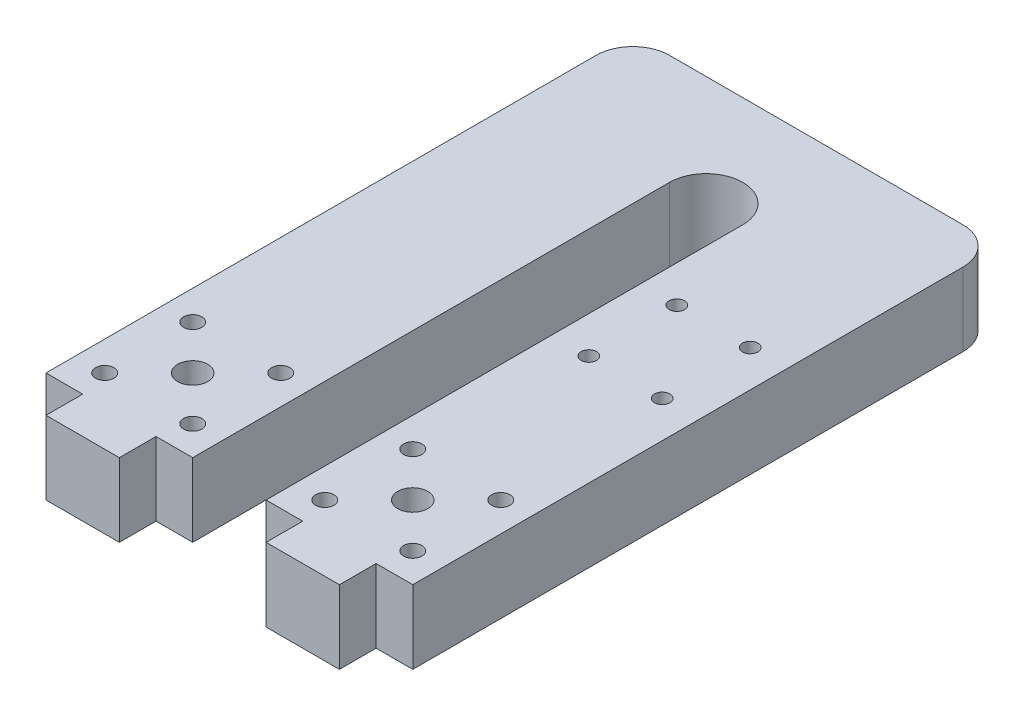
ISO-10303-21;
HEADER;
FILE_DESCRIPTION(('STEP AP214'),'2;1');
FILE_NAME('part.step','',(''),(''),'','','');
FILE_SCHEMA(('AUTOMOTIVE_DESIGN { 1 0 10303 214 1 1 1 1 }'));
ENDSEC;
DATA;
#1=APPLICATION_CONTEXT('core data for automotive mechanical design processes');
#2=APPLICATION_PROTOCOL_DEFINITION('international standard','automotive_design',2000,#1);
#3=PRODUCT_CONTEXT('',#1,'mechanical');
#4=PRODUCT('Part','Part','',(#3));
#5=PRODUCT_RELATED_PRODUCT_CATEGORY('part','',(#4));
#6=PRODUCT_DEFINITION_FORMATION('','',#4);
#7=PRODUCT_DEFINITION_CONTEXT('part definition',#1,'design');
#8=PRODUCT_DEFINITION('design','',#6,#7);
#9=PRODUCT_DEFINITION_SHAPE('','',#8);
#10=(LENGTH_UNIT() NAMED_UNIT(*) SI_UNIT(.MILLI.,.METRE.));
#11=(NAMED_UNIT(*) PLANE_ANGLE_UNIT() SI_UNIT($,.RADIAN.));
#12=(NAMED_UNIT(*) SI_UNIT($,.STERADIAN.) SOLID_ANGLE_UNIT());
#13=UNCERTAINTY_MEASURE_WITH_UNIT(LENGTH_MEASURE(1.E-05),#10,'distance_accuracy_value','');
#14=(GEOMETRIC_REPRESENTATION_CONTEXT(3) GLOBAL_UNCERTAINTY_ASSIGNED_CONTEXT((#13)) GLOBAL_UNIT_ASSIGNED_CONTEXT((#10,
#11,#12)) REPRESENTATION_CONTEXT('',''));
#15=CARTESIAN_POINT('',(0.,0.,0.));
#16=DIRECTION('',(0.,0.,1.));
#17=DIRECTION('',(1.,0.,0.));
#18=AXIS2_PLACEMENT_3D('',#15,#16,#17);
#19=CARTESIAN_POINT('',(-50.,20.,0.));
#20=DIRECTION('',(0.,0.,-1.));
#21=DIRECTION('',(-1.,0.,0.));
#22=AXIS2_PLACEMENT_3D('',#19,#20,#21);
#23=PLANE('',#22);
#24=DIRECTION('',(0.,-1.,0.));
#25=VECTOR('',#24,1.);
#26=CARTESIAN_POINT('',(-40.,0.,0.));
#27=LINE('',#26,#25);
#28=CARTESIAN_POINT('',(-40.,20.,0.));
#29=VERTEX_POINT('',#28);
#30=CARTESIAN_POINT('',(-40.,0.,0.));
#31=VERTEX_POINT('',#30);
#32=EDGE_CURVE('E59',#29,#31,#27,.T.);
#33=ORIENTED_EDGE('',*,*,#32,.F.);
#34=DIRECTION('',(1.,0.,0.));
#35=VECTOR('',#34,1.);
#36=CARTESIAN_POINT('',(-50.,20.,0.));
#37=LINE('',#36,#35);
#38=CARTESIAN_POINT('',(-50.,20.,0.));
#39=VERTEX_POINT('',#38);
#40=EDGE_CURVE('E294',#39,#29,#37,.T.);
#41=ORIENTED_EDGE('',*,*,#40,.F.);
#42=DIRECTION('',(0.,-1.,0.));
#43=VECTOR('',#42,1.);
#44=CARTESIAN_POINT('',(-50.,20.,0.));
#45=LINE('',#44,#43);
#46=CARTESIAN_POINT('',(-50.,0.,0.));
#47=VERTEX_POINT('',#46);
#48=EDGE_CURVE('E334',#39,#47,#45,.T.);
#49=ORIENTED_EDGE('',*,*,#48,.T.);
#50=DIRECTION('',(1.,0.,0.));
#51=VECTOR('',#50,1.);
#52=CARTESIAN_POINT('',(-50.,0.,0.));
#53=LINE('',#52,#51);
#54=EDGE_CURVE('E309',#47,#31,#53,.T.);
#55=ORIENTED_EDGE('',*,*,#54,.T.);
#56=EDGE_LOOP('',(#33,#41,#49,#55));
#57=FACE_BOUND('',#56,.T.);
#58=ADVANCED_FACE('F35',(#57),#23,.F.);
#59=DIRECTION('',(0.,1.,0.));
#60=VECTOR('',#59,1.);
#61=CARTESIAN_POINT('',(-20.,0.,0.));
#62=LINE('',#61,#60);
#63=CARTESIAN_POINT('',(-20.,0.,0.));
#64=VERTEX_POINT('',#63);
#65=CARTESIAN_POINT('',(-20.,20.,0.));
#66=VERTEX_POINT('',#65);
#67=EDGE_CURVE('E181',#64,#66,#62,.T.);
#68=ORIENTED_EDGE('',*,*,#67,.F.);
#69=CARTESIAN_POINT('',(-10.,0.,0.));
#70=VERTEX_POINT('',#69);
#71=EDGE_CURVE('E312',#64,#70,#53,.T.);
#72=ORIENTED_EDGE('',*,*,#71,.T.);
#73=DIRECTION('',(0.,1.,0.));
#74=VECTOR('',#73,1.);
#75=CARTESIAN_POINT('',(-10.,0.,0.));
#76=LINE('',#75,#74);
#77=CARTESIAN_POINT('',(-10.,20.,0.));
#78=VERTEX_POINT('',#77);
#79=EDGE_CURVE('E220',#70,#78,#76,.T.);
#80=ORIENTED_EDGE('',*,*,#79,.T.);
#81=EDGE_CURVE('E51',#66,#78,#37,.T.);
#82=ORIENTED_EDGE('',*,*,#81,.F.);
#83=EDGE_LOOP('',(#68,#72,#80,#82));
#84=FACE_BOUND('',#83,.T.);
#85=ADVANCED_FACE('F392',(#84),#23,.F.);
#86=DIRECTION('',(0.,-1.,0.));
#87=VECTOR('',#86,1.);
#88=CARTESIAN_POINT('',(20.,0.,0.));
#89=LINE('',#88,#87);
#90=CARTESIAN_POINT('',(20.,20.,0.));
#91=VERTEX_POINT('',#90);
#92=CARTESIAN_POINT('',(20.,0.,0.));
#93=VERTEX_POINT('',#92);
#94=EDGE_CURVE('E184',#91,#93,#89,.T.);
#95=ORIENTED_EDGE('',*,*,#94,.F.);
#96=CARTESIAN_POINT('',(10.,20.,0.));
#97=VERTEX_POINT('',#96);
#98=EDGE_CURVE('E297',#97,#91,#37,.T.);
#99=ORIENTED_EDGE('',*,*,#98,.F.);
#100=DIRECTION('',(0.,1.,0.));
#101=VECTOR('',#100,1.);
#102=CARTESIAN_POINT('',(10.,0.,0.));
#103=LINE('',#102,#101);
#104=CARTESIAN_POINT('',(10.,0.,0.));
#105=VERTEX_POINT('',#104);
#106=EDGE_CURVE('E225',#105,#97,#103,.T.);
#107=ORIENTED_EDGE('',*,*,#106,.F.);
#108=EDGE_CURVE('E313',#105,#93,#53,.T.);
#109=ORIENTED_EDGE('',*,*,#108,.T.);
#110=EDGE_LOOP('',(#95,#99,#107,#109));
#111=FACE_BOUND('',#110,.T.);
#112=ADVANCED_FACE('F423',(#111),#23,.F.);
#113=DIRECTION('',(0.,1.,0.));
#114=VECTOR('',#113,1.);
#115=CARTESIAN_POINT('',(40.,0.,0.));
#116=LINE('',#115,#114);
#117=CARTESIAN_POINT('',(40.,0.,0.));
#118=VERTEX_POINT('',#117);
#119=CARTESIAN_POINT('',(40.,20.,0.));
#120=VERTEX_POINT('',#119);
#121=EDGE_CURVE('E187',#118,#120,#116,.T.);
#122=ORIENTED_EDGE('',*,*,#121,.F.);
#123=CARTESIAN_POINT('',(50.,0.,0.));
#124=VERTEX_POINT('',#123);
#125=EDGE_CURVE('E308',#118,#124,#53,.T.);
#126=ORIENTED_EDGE('',*,*,#125,.T.);
#127=DIRECTION('',(0.,-1.,0.));
#128=VECTOR('',#127,1.);
#129=CARTESIAN_POINT('',(50.,20.,0.));
#130=LINE('',#129,#128);
#131=CARTESIAN_POINT('',(50.,20.,0.));
#132=VERTEX_POINT('',#131);
#133=EDGE_CURVE('E331',#132,#124,#130,.T.);
#134=ORIENTED_EDGE('',*,*,#133,.F.);
#135=EDGE_CURVE('E292',#120,#132,#37,.T.);
#136=ORIENTED_EDGE('',*,*,#135,.F.);
#137=EDGE_LOOP('',(#122,#126,#134,#136));
#138=FACE_BOUND('',#137,.T.);
#139=ADVANCED_FACE('F359',(#138),#23,.F.);
#140=CARTESIAN_POINT('',(0.,0.,-130.));
#141=DIRECTION('',(0.,1.,0.));
#142=DIRECTION('',(0.,0.,1.));
#143=AXIS2_PLACEMENT_3D('',#140,#141,#142);
#144=CYLINDRICAL_SURFACE('',#143,10.);
#145=DIRECTION('',(0.,-1.,0.));
#146=VECTOR('',#145,1.);
#147=CARTESIAN_POINT('',(-10.,0.,-130.));
#148=LINE('',#147,#146);
#149=CARTESIAN_POINT('',(-10.,0.,-130.));
#150=VERTEX_POINT('',#149);
#151=CARTESIAN_POINT('',(-10.,20.,-130.));
#152=VERTEX_POINT('',#151);
#153=EDGE_CURVE('E337',#150,#152,#148,.F.);
#154=ORIENTED_EDGE('',*,*,#153,.F.);
#155=CARTESIAN_POINT('',(0.,0.,-130.));
#156=DIRECTION('',(0.,-1.,0.));
#157=DIRECTION('',(0.,0.,-1.));
#158=AXIS2_PLACEMENT_3D('',#155,#156,#157);
#159=CIRCLE('',#158,10.);
#160=CARTESIAN_POINT('',(9.99999999999998,0.,-130.));
#161=VERTEX_POINT('',#160);
#162=EDGE_CURVE('E44',#150,#161,#159,.T.);
#163=ORIENTED_EDGE('',*,*,#162,.T.);
#164=DIRECTION('',(0.,-1.,0.));
#165=VECTOR('',#164,1.);
#166=CARTESIAN_POINT('',(9.99999999999998,0.,-130.));
#167=LINE('',#166,#165);
#168=CARTESIAN_POINT('',(9.99999999999998,20.,-130.));
#169=VERTEX_POINT('',#168);
#170=EDGE_CURVE('E340',#169,#161,#167,.T.);
#171=ORIENTED_EDGE('',*,*,#170,.F.);
#172=CARTESIAN_POINT('',(0.,20.,-130.));
#173=DIRECTION('',(0.,-1.,0.));
#174=DIRECTION('',(0.,0.,-1.));
#175=AXIS2_PLACEMENT_3D('',#172,#173,#174);
#176=CIRCLE('',#175,10.);
#177=EDGE_CURVE('E11',#169,#152,#176,.F.);
#178=ORIENTED_EDGE('',*,*,#177,.T.);
#179=EDGE_LOOP('',(#154,#163,#171,#178));
#180=FACE_BOUND('',#179,.T.);
#181=ADVANCED_FACE('F38',(#180),#144,.F.);
#182=CARTESIAN_POINT('',(-40.,20.,-150.));
#183=DIRECTION('',(0.,-1.,0.));
#184=DIRECTION('',(0.,0.,-1.));
#185=AXIS2_PLACEMENT_3D('',#182,#183,#184);
#186=PLANE('',#185);
#187=CARTESIAN_POINT('',(40.,20.,-102.));
#188=DIRECTION('',(0.,1.,0.));
#189=DIRECTION('',(0.,0.,1.));
#190=AXIS2_PLACEMENT_3D('',#187,#188,#189);
#191=CIRCLE('',#190,2.1);
#192=CARTESIAN_POINT('',(40.,20.,-99.9));
#193=VERTEX_POINT('',#192);
#194=EDGE_CURVE('E522',#193,#193,#191,.T.);
#195=ORIENTED_EDGE('',*,*,#194,.F.);
#196=EDGE_LOOP('',(#195));
#197=FACE_BOUND('',#196,.T.);
#198=CARTESIAN_POINT('',(20.,20.,-78.));
#199=DIRECTION('',(0.,1.,0.));
#200=DIRECTION('',(0.,0.,1.));
#201=AXIS2_PLACEMENT_3D('',#198,#199,#200);
#202=CIRCLE('',#201,2.1);
#203=CARTESIAN_POINT('',(20.,20.,-75.9));
#204=VERTEX_POINT('',#203);
#205=EDGE_CURVE('E518',#204,#204,#202,.T.);
#206=ORIENTED_EDGE('',*,*,#205,.F.);
#207=EDGE_LOOP('',(#206));
#208=FACE_BOUND('',#207,.T.);
#209=CARTESIAN_POINT('',(40.,20.,-78.));
#210=DIRECTION('',(0.,1.,0.));
#211=DIRECTION('',(0.,0.,1.));
#212=AXIS2_PLACEMENT_3D('',#209,#210,#211);
#213=CIRCLE('',#212,2.1);
#214=CARTESIAN_POINT('',(40.,20.,-75.9));
#215=VERTEX_POINT('',#214);
#216=EDGE_CURVE('E526',#215,#215,#213,.T.);
#217=ORIENTED_EDGE('',*,*,#216,.F.);
#218=EDGE_LOOP('',(#217));
#219=FACE_BOUND('',#218,.T.);
#220=CARTESIAN_POINT('',(20.,20.,-102.));
#221=DIRECTION('',(0.,1.,0.));
#222=DIRECTION('',(0.,0.,1.));
#223=AXIS2_PLACEMENT_3D('',#220,#221,#222);
#224=CIRCLE('',#223,2.1);
#225=CARTESIAN_POINT('',(20.,20.,-99.9));
#226=VERTEX_POINT('',#225);
#227=EDGE_CURVE('E513',#226,#226,#224,.T.);
#228=ORIENTED_EDGE('',*,*,#227,.F.);
#229=EDGE_LOOP('',(#228));
#230=FACE_BOUND('',#229,.T.);
#231=ORIENTED_EDGE('',*,*,#40,.T.);
#232=DIRECTION('',(0.,0.,-1.));
#233=VECTOR('',#232,1.);
#234=CARTESIAN_POINT('',(-40.,20.,10.));
#235=LINE('',#234,#233);
#236=CARTESIAN_POINT('',(-40.,20.,10.));
#237=VERTEX_POINT('',#236);
#238=EDGE_CURVE('E397',#237,#29,#235,.T.);
#239=ORIENTED_EDGE('',*,*,#238,.F.);
#240=DIRECTION('',(-1.,0.,0.));
#241=VECTOR('',#240,1.);
#242=CARTESIAN_POINT('',(-40.,20.,10.));
#243=LINE('',#242,#241);
#244=CARTESIAN_POINT('',(-20.,20.,10.));
#245=VERTEX_POINT('',#244);
#246=EDGE_CURVE('E177',#245,#237,#243,.T.);
#247=ORIENTED_EDGE('',*,*,#246,.F.);
#248=DIRECTION('',(0.,0.,-1.));
#249=VECTOR('',#248,1.);
#250=CARTESIAN_POINT('',(-20.,20.,10.));
#251=LINE('',#250,#249);
#252=EDGE_CURVE('E189',#245,#66,#251,.T.);
#253=ORIENTED_EDGE('',*,*,#252,.T.);
#254=ORIENTED_EDGE('',*,*,#81,.T.);
#255=DIRECTION('',(0.,0.,1.));
#256=VECTOR('',#255,1.);
#257=CARTESIAN_POINT('',(-10.,20.,0.));
#258=LINE('',#257,#256);
#259=EDGE_CURVE('E212',#152,#78,#258,.T.);
#260=ORIENTED_EDGE('',*,*,#259,.F.);
#261=ORIENTED_EDGE('',*,*,#177,.F.);
#262=DIRECTION('',(0.,0.,-1.));
#263=VECTOR('',#262,1.);
#264=CARTESIAN_POINT('',(10.,20.,0.));
#265=LINE('',#264,#263);
#266=EDGE_CURVE('E217',#97,#169,#265,.T.);
#267=ORIENTED_EDGE('',*,*,#266,.F.);
#268=ORIENTED_EDGE('',*,*,#98,.T.);
#269=DIRECTION('',(0.,0.,-1.));
#270=VECTOR('',#269,1.);
#271=CARTESIAN_POINT('',(20.,20.,10.));
#272=LINE('',#271,#270);
#273=CARTESIAN_POINT('',(20.,20.,10.));
#274=VERTEX_POINT('',#273);
#275=EDGE_CURVE('E201',#274,#91,#272,.T.);
#276=ORIENTED_EDGE('',*,*,#275,.F.);
#277=DIRECTION('',(-1.,0.,0.));
#278=VECTOR('',#277,1.);
#279=CARTESIAN_POINT('',(20.,20.,10.));
#280=LINE('',#279,#278);
#281=CARTESIAN_POINT('',(40.,20.,10.));
#282=VERTEX_POINT('',#281);
#283=EDGE_CURVE('E200',#282,#274,#280,.T.);
#284=ORIENTED_EDGE('',*,*,#283,.F.);
#285=DIRECTION('',(0.,0.,-1.));
#286=VECTOR('',#285,1.);
#287=CARTESIAN_POINT('',(40.,20.,10.));
#288=LINE('',#287,#286);
#289=EDGE_CURVE('E206',#282,#120,#288,.T.);
#290=ORIENTED_EDGE('',*,*,#289,.T.);
#291=ORIENTED_EDGE('',*,*,#135,.T.);
#292=DIRECTION('',(0.,0.,-1.));
#293=VECTOR('',#292,1.);
#294=CARTESIAN_POINT('',(50.,20.,0.));
#295=LINE('',#294,#293);
#296=CARTESIAN_POINT('',(50.,20.,-150.));
#297=VERTEX_POINT('',#296);
#298=EDGE_CURVE('E296',#132,#297,#295,.T.);
#299=ORIENTED_EDGE('',*,*,#298,.T.);
#300=CARTESIAN_POINT('',(40.,20.,-150.));
#301=DIRECTION('',(0.,1.,0.));
#302=DIRECTION('',(0.,0.,-1.));
#303=AXIS2_PLACEMENT_3D('',#300,#301,#302);
#304=CIRCLE('',#303,9.99999999999999);
#305=CARTESIAN_POINT('',(40.,20.,-160.));
#306=VERTEX_POINT('',#305);
#307=EDGE_CURVE('E299',#297,#306,#304,.T.);
#308=ORIENTED_EDGE('',*,*,#307,.T.);
#309=DIRECTION('',(-1.,0.,0.));
#310=VECTOR('',#309,1.);
#311=CARTESIAN_POINT('',(-40.,20.,-160.));
#312=LINE('',#311,#310);
#313=CARTESIAN_POINT('',(-40.,20.,-160.));
#314=VERTEX_POINT('',#313);
#315=EDGE_CURVE('E301',#306,#314,#312,.T.);
#316=ORIENTED_EDGE('',*,*,#315,.T.);
#317=CARTESIAN_POINT('',(-40.,20.,-150.));
#318=DIRECTION('',(0.,1.,0.));
#319=DIRECTION('',(0.,0.,-1.));
#320=AXIS2_PLACEMENT_3D('',#317,#318,#319);
#321=CIRCLE('',#320,9.99999999999999);
#322=CARTESIAN_POINT('',(-50.,20.,-150.));
#323=VERTEX_POINT('',#322);
#324=EDGE_CURVE('E303',#314,#323,#321,.T.);
#325=ORIENTED_EDGE('',*,*,#324,.T.);
#326=DIRECTION('',(0.,0.,1.));
#327=VECTOR('',#326,1.);
#328=CARTESIAN_POINT('',(-50.,20.,0.));
#329=LINE('',#328,#327);
#330=EDGE_CURVE('E289',#323,#39,#329,.T.);
#331=ORIENTED_EDGE('',*,*,#330,.T.);
#332=EDGE_LOOP('',(#231,#239,#247,#253,#254,#260,#261,#267,#268,#276,#284,#290,#291,#299,#308,
#316,#325,#331));
#333=FACE_BOUND('',#332,.T.);
#334=CARTESIAN_POINT('',(-30.,20.,-20.));
#335=DIRECTION('',(0.,1.,0.));
#336=DIRECTION('',(0.,0.,1.));
#337=AXIS2_PLACEMENT_3D('',#334,#335,#336);
#338=CIRCLE('',#337,4.1);
#339=CARTESIAN_POINT('',(-30.,20.,-15.9));
#340=VERTEX_POINT('',#339);
#341=EDGE_CURVE('E283',#340,#340,#338,.T.);
#342=ORIENTED_EDGE('',*,*,#341,.F.);
#343=EDGE_LOOP('',(#342));
#344=FACE_BOUND('',#343,.T.);
#345=CARTESIAN_POINT('',(30.,20.,-20.));
#346=DIRECTION('',(0.,1.,0.));
#347=DIRECTION('',(0.,0.,1.));
#348=AXIS2_PLACEMENT_3D('',#345,#346,#347);
#349=CIRCLE('',#348,4.1);
#350=CARTESIAN_POINT('',(30.,20.,-15.9));
#351=VERTEX_POINT('',#350);
#352=EDGE_CURVE('E277',#351,#351,#349,.T.);
#353=ORIENTED_EDGE('',*,*,#352,.F.);
#354=EDGE_LOOP('',(#353));
#355=FACE_BOUND('',#354,.T.);
#356=CARTESIAN_POINT('',(-42.,20.,-32.));
#357=DIRECTION('',(0.,1.,0.));
#358=DIRECTION('',(0.,0.,1.));
#359=AXIS2_PLACEMENT_3D('',#356,#357,#358);
#360=CIRCLE('',#359,2.5);
#361=CARTESIAN_POINT('',(-42.,20.,-29.5));
#362=VERTEX_POINT('',#361);
#363=EDGE_CURVE('E271',#362,#362,#360,.T.);
#364=ORIENTED_EDGE('',*,*,#363,.F.);
#365=EDGE_LOOP('',(#364));
#366=FACE_BOUND('',#365,.T.);
#367=CARTESIAN_POINT('',(-18.,20.,-32.));
#368=DIRECTION('',(0.,1.,0.));
#369=DIRECTION('',(0.,0.,1.));
#370=AXIS2_PLACEMENT_3D('',#367,#368,#369);
#371=CIRCLE('',#370,2.5);
#372=CARTESIAN_POINT('',(-18.,20.,-29.5));
#373=VERTEX_POINT('',#372);
#374=EDGE_CURVE('E265',#373,#373,#371,.T.);
#375=ORIENTED_EDGE('',*,*,#374,.F.);
#376=EDGE_LOOP('',(#375));
#377=FACE_BOUND('',#376,.T.);
#378=CARTESIAN_POINT('',(-18.,20.,-8.));
#379=DIRECTION('',(0.,1.,0.));
#380=DIRECTION('',(0.,0.,1.));
#381=AXIS2_PLACEMENT_3D('',#378,#379,#380);
#382=CIRCLE('',#381,2.5);
#383=CARTESIAN_POINT('',(-18.,20.,-5.5));
#384=VERTEX_POINT('',#383);
#385=EDGE_CURVE('E259',#384,#384,#382,.T.);
#386=ORIENTED_EDGE('',*,*,#385,.F.);
#387=EDGE_LOOP('',(#386));
#388=FACE_BOUND('',#387,.T.);
#389=CARTESIAN_POINT('',(-42.,20.,-8.));
#390=DIRECTION('',(0.,1.,0.));
#391=DIRECTION('',(0.,0.,1.));
#392=AXIS2_PLACEMENT_3D('',#389,#390,#391);
#393=CIRCLE('',#392,2.5);
#394=CARTESIAN_POINT('',(-42.,20.,-5.5));
#395=VERTEX_POINT('',#394);
#396=EDGE_CURVE('E253',#395,#395,#393,.T.);
#397=ORIENTED_EDGE('',*,*,#396,.F.);
#398=EDGE_LOOP('',(#397));
#399=FACE_BOUND('',#398,.T.);
#400=CARTESIAN_POINT('',(18.,20.,-32.));
#401=DIRECTION('',(0.,1.,0.));
#402=DIRECTION('',(0.,0.,-1.));
#403=AXIS2_PLACEMENT_3D('',#400,#401,#402);
#404=CIRCLE('',#403,2.5);
#405=CARTESIAN_POINT('',(18.,20.,-34.5));
#406=VERTEX_POINT('',#405);
#407=EDGE_CURVE('E247',#406,#406,#404,.T.);
#408=ORIENTED_EDGE('',*,*,#407,.F.);
#409=EDGE_LOOP('',(#408));
#410=FACE_BOUND('',#409,.T.);
#411=CARTESIAN_POINT('',(18.,20.,-8.));
#412=DIRECTION('',(0.,1.,0.));
#413=DIRECTION('',(0.,0.,-1.));
#414=AXIS2_PLACEMENT_3D('',#411,#412,#413);
#415=CIRCLE('',#414,2.5);
#416=CARTESIAN_POINT('',(18.,20.,-10.5));
#417=VERTEX_POINT('',#416);
#418=EDGE_CURVE('E241',#417,#417,#415,.T.);
#419=ORIENTED_EDGE('',*,*,#418,.F.);
#420=EDGE_LOOP('',(#419));
#421=FACE_BOUND('',#420,.T.);
#422=CARTESIAN_POINT('',(42.,20.,-8.));
#423=DIRECTION('',(0.,1.,0.));
#424=DIRECTION('',(0.,0.,-1.));
#425=AXIS2_PLACEMENT_3D('',#422,#423,#424);
#426=CIRCLE('',#425,2.5);
#427=CARTESIAN_POINT('',(42.,20.,-10.5));
#428=VERTEX_POINT('',#427);
#429=EDGE_CURVE('E235',#428,#428,#426,.T.);
#430=ORIENTED_EDGE('',*,*,#429,.F.);
#431=EDGE_LOOP('',(#430));
#432=FACE_BOUND('',#431,.T.);
#433=CARTESIAN_POINT('',(42.,20.,-32.));
#434=DIRECTION('',(0.,1.,0.));
#435=DIRECTION('',(0.,0.,-1.));
#436=AXIS2_PLACEMENT_3D('',#433,#434,#435);
#437=CIRCLE('',#436,2.5);
#438=CARTESIAN_POINT('',(42.,20.,-34.5));
#439=VERTEX_POINT('',#438);
#440=EDGE_CURVE('E229',#439,#439,#437,.T.);
#441=ORIENTED_EDGE('',*,*,#440,.F.);
#442=EDGE_LOOP('',(#441));
#443=FACE_BOUND('',#442,.T.);
#444=ADVANCED_FACE('F380',(#197,#208,#219,#230,#333,#344,#355,#366,#377,#388,#399,#410,#421,
#432,#443),#186,.F.);
#445=CARTESIAN_POINT('',(-40.,0.,-150.));
#446=DIRECTION('',(0.,-1.,0.));
#447=DIRECTION('',(0.,0.,-1.));
#448=AXIS2_PLACEMENT_3D('',#445,#446,#447);
#449=PLANE('',#448);
#450=CARTESIAN_POINT('',(40.,0.,-102.));
#451=DIRECTION('',(0.,1.,0.));
#452=DIRECTION('',(0.,0.,1.));
#453=AXIS2_PLACEMENT_3D('',#450,#451,#452);
#454=CIRCLE('',#453,2.1);
#455=CARTESIAN_POINT('',(40.,0.,-99.9));
#456=VERTEX_POINT('',#455);
#457=EDGE_CURVE('E501',#456,#456,#454,.T.);
#458=ORIENTED_EDGE('',*,*,#457,.T.);
#459=EDGE_LOOP('',(#458));
#460=FACE_BOUND('',#459,.T.);
#461=CARTESIAN_POINT('',(20.,0.,-78.));
#462=DIRECTION('',(0.,1.,0.));
#463=DIRECTION('',(0.,0.,1.));
#464=AXIS2_PLACEMENT_3D('',#461,#462,#463);
#465=CIRCLE('',#464,2.1);
#466=CARTESIAN_POINT('',(20.,0.,-75.9));
#467=VERTEX_POINT('',#466);
#468=EDGE_CURVE('E505',#467,#467,#465,.T.);
#469=ORIENTED_EDGE('',*,*,#468,.T.);
#470=EDGE_LOOP('',(#469));
#471=FACE_BOUND('',#470,.T.);
#472=CARTESIAN_POINT('',(40.,0.,-78.));
#473=DIRECTION('',(0.,1.,0.));
#474=DIRECTION('',(0.,0.,1.));
#475=AXIS2_PLACEMENT_3D('',#472,#473,#474);
#476=CIRCLE('',#475,2.1);
#477=CARTESIAN_POINT('',(40.,0.,-75.9));
#478=VERTEX_POINT('',#477);
#479=EDGE_CURVE('E509',#478,#478,#476,.T.);
#480=ORIENTED_EDGE('',*,*,#479,.T.);
#481=EDGE_LOOP('',(#480));
#482=FACE_BOUND('',#481,.T.);
#483=CARTESIAN_POINT('',(20.,0.,-102.));
#484=DIRECTION('',(0.,1.,0.));
#485=DIRECTION('',(0.,0.,1.));
#486=AXIS2_PLACEMENT_3D('',#483,#484,#485);
#487=CIRCLE('',#486,2.1);
#488=CARTESIAN_POINT('',(20.,0.,-99.9));
#489=VERTEX_POINT('',#488);
#490=EDGE_CURVE('E400',#489,#489,#487,.T.);
#491=ORIENTED_EDGE('',*,*,#490,.T.);
#492=EDGE_LOOP('',(#491));
#493=FACE_BOUND('',#492,.T.);
#494=ORIENTED_EDGE('',*,*,#162,.F.);
#495=DIRECTION('',(0.,0.,1.));
#496=VECTOR('',#495,1.);
#497=CARTESIAN_POINT('',(-10.,0.,0.));
#498=LINE('',#497,#496);
#499=EDGE_CURVE('E213',#150,#70,#498,.T.);
#500=ORIENTED_EDGE('',*,*,#499,.T.);
#501=ORIENTED_EDGE('',*,*,#71,.F.);
#502=DIRECTION('',(0.,0.,-1.));
#503=VECTOR('',#502,1.);
#504=CARTESIAN_POINT('',(-20.,0.,10.));
#505=LINE('',#504,#503);
#506=CARTESIAN_POINT('',(-20.,0.,10.));
#507=VERTEX_POINT('',#506);
#508=EDGE_CURVE('E168',#507,#64,#505,.T.);
#509=ORIENTED_EDGE('',*,*,#508,.F.);
#510=DIRECTION('',(1.,0.,0.));
#511=VECTOR('',#510,1.);
#512=CARTESIAN_POINT('',(-40.,0.,10.));
#513=LINE('',#512,#511);
#514=CARTESIAN_POINT('',(-40.,0.,10.));
#515=VERTEX_POINT('',#514);
#516=EDGE_CURVE('E161',#515,#507,#513,.T.);
#517=ORIENTED_EDGE('',*,*,#516,.F.);
#518=DIRECTION('',(0.,0.,-1.));
#519=VECTOR('',#518,1.);
#520=CARTESIAN_POINT('',(-40.,0.,10.));
#521=LINE('',#520,#519);
#522=EDGE_CURVE('E166',#515,#31,#521,.T.);
#523=ORIENTED_EDGE('',*,*,#522,.T.);
#524=ORIENTED_EDGE('',*,*,#54,.F.);
#525=DIRECTION('',(0.,0.,1.));
#526=VECTOR('',#525,1.);
#527=CARTESIAN_POINT('',(-50.,0.,0.));
#528=LINE('',#527,#526);
#529=CARTESIAN_POINT('',(-50.,0.,-150.));
#530=VERTEX_POINT('',#529);
#531=EDGE_CURVE('E286',#530,#47,#528,.T.);
#532=ORIENTED_EDGE('',*,*,#531,.F.);
#533=CARTESIAN_POINT('',(-40.,0.,-150.));
#534=DIRECTION('',(0.,1.,0.));
#535=DIRECTION('',(0.,0.,-1.));
#536=AXIS2_PLACEMENT_3D('',#533,#534,#535);
#537=CIRCLE('',#536,9.99999999999999);
#538=CARTESIAN_POINT('',(-40.,0.,-160.));
#539=VERTEX_POINT('',#538);
#540=EDGE_CURVE('E293',#539,#530,#537,.T.);
#541=ORIENTED_EDGE('',*,*,#540,.F.);
#542=DIRECTION('',(-1.,0.,0.));
#543=VECTOR('',#542,1.);
#544=CARTESIAN_POINT('',(-40.,0.,-160.));
#545=LINE('',#544,#543);
#546=CARTESIAN_POINT('',(40.,0.,-160.));
#547=VERTEX_POINT('',#546);
#548=EDGE_CURVE('E317',#547,#539,#545,.T.);
#549=ORIENTED_EDGE('',*,*,#548,.F.);
#550=CARTESIAN_POINT('',(40.,0.,-150.));
#551=DIRECTION('',(0.,1.,0.));
#552=DIRECTION('',(0.,0.,-1.));
#553=AXIS2_PLACEMENT_3D('',#550,#551,#552);
#554=CIRCLE('',#553,9.99999999999999);
#555=CARTESIAN_POINT('',(50.,0.,-150.));
#556=VERTEX_POINT('',#555);
#557=EDGE_CURVE('E315',#556,#547,#554,.T.);
#558=ORIENTED_EDGE('',*,*,#557,.F.);
#559=DIRECTION('',(0.,0.,-1.));
#560=VECTOR('',#559,1.);
#561=CARTESIAN_POINT('',(50.,0.,0.));
#562=LINE('',#561,#560);
#563=EDGE_CURVE('E311',#124,#556,#562,.T.);
#564=ORIENTED_EDGE('',*,*,#563,.F.);
#565=ORIENTED_EDGE('',*,*,#125,.F.);
#566=DIRECTION('',(0.,0.,-1.));
#567=VECTOR('',#566,1.);
#568=CARTESIAN_POINT('',(40.,0.,10.));
#569=LINE('',#568,#567);
#570=CARTESIAN_POINT('',(40.,0.,10.));
#571=VERTEX_POINT('',#570);
#572=EDGE_CURVE('E208',#571,#118,#569,.T.);
#573=ORIENTED_EDGE('',*,*,#572,.F.);
#574=DIRECTION('',(1.,0.,0.));
#575=VECTOR('',#574,1.);
#576=CARTESIAN_POINT('',(20.,0.,10.));
#577=LINE('',#576,#575);
#578=CARTESIAN_POINT('',(20.,0.,10.));
#579=VERTEX_POINT('',#578);
#580=EDGE_CURVE('E196',#579,#571,#577,.T.);
#581=ORIENTED_EDGE('',*,*,#580,.F.);
#582=DIRECTION('',(0.,0.,-1.));
#583=VECTOR('',#582,1.);
#584=CARTESIAN_POINT('',(20.,0.,10.));
#585=LINE('',#584,#583);
#586=EDGE_CURVE('E210',#579,#93,#585,.T.);
#587=ORIENTED_EDGE('',*,*,#586,.T.);
#588=ORIENTED_EDGE('',*,*,#108,.F.);
#589=DIRECTION('',(0.,0.,-1.));
#590=VECTOR('',#589,1.);
#591=CARTESIAN_POINT('',(10.,0.,0.));
#592=LINE('',#591,#590);
#593=EDGE_CURVE('E216',#105,#161,#592,.T.);
#594=ORIENTED_EDGE('',*,*,#593,.T.);
#595=EDGE_LOOP('',(#494,#500,#501,#509,#517,#523,#524,#532,#541,#549,#558,#564,#565,#573,#581,
#587,#588,#594));
#596=FACE_BOUND('',#595,.T.);
#597=CARTESIAN_POINT('',(42.,0.,-8.));
#598=DIRECTION('',(0.,1.,0.));
#599=DIRECTION('',(0.,0.,-1.));
#600=AXIS2_PLACEMENT_3D('',#597,#598,#599);
#601=CIRCLE('',#600,2.5);
#602=CARTESIAN_POINT('',(42.,0.,-10.5));
#603=VERTEX_POINT('',#602);
#604=EDGE_CURVE('E232',#603,#603,#601,.T.);
#605=ORIENTED_EDGE('',*,*,#604,.T.);
#606=EDGE_LOOP('',(#605));
#607=FACE_BOUND('',#606,.T.);
#608=CARTESIAN_POINT('',(18.,0.,-32.));
#609=DIRECTION('',(0.,1.,0.));
#610=DIRECTION('',(0.,0.,-1.));
#611=AXIS2_PLACEMENT_3D('',#608,#609,#610);
#612=CIRCLE('',#611,2.5);
#613=CARTESIAN_POINT('',(18.,0.,-34.5));
#614=VERTEX_POINT('',#613);
#615=EDGE_CURVE('E244',#614,#614,#612,.T.);
#616=ORIENTED_EDGE('',*,*,#615,.T.);
#617=EDGE_LOOP('',(#616));
#618=FACE_BOUND('',#617,.T.);
#619=CARTESIAN_POINT('',(-18.,0.,-8.));
#620=DIRECTION('',(0.,1.,0.));
#621=DIRECTION('',(0.,0.,1.));
#622=AXIS2_PLACEMENT_3D('',#619,#620,#621);
#623=CIRCLE('',#622,2.5);
#624=CARTESIAN_POINT('',(-18.,0.,-5.5));
#625=VERTEX_POINT('',#624);
#626=EDGE_CURVE('E256',#625,#625,#623,.T.);
#627=ORIENTED_EDGE('',*,*,#626,.T.);
#628=EDGE_LOOP('',(#627));
#629=FACE_BOUND('',#628,.T.);
#630=CARTESIAN_POINT('',(-42.,0.,-32.));
#631=DIRECTION('',(0.,1.,0.));
#632=DIRECTION('',(0.,0.,1.));
#633=AXIS2_PLACEMENT_3D('',#630,#631,#632);
#634=CIRCLE('',#633,2.5);
#635=CARTESIAN_POINT('',(-42.,0.,-29.5));
#636=VERTEX_POINT('',#635);
#637=EDGE_CURVE('E268',#636,#636,#634,.T.);
#638=ORIENTED_EDGE('',*,*,#637,.T.);
#639=EDGE_LOOP('',(#638));
#640=FACE_BOUND('',#639,.T.);
#641=CARTESIAN_POINT('',(-30.,0.,-20.));
#642=DIRECTION('',(0.,1.,0.));
#643=DIRECTION('',(0.,0.,1.));
#644=AXIS2_PLACEMENT_3D('',#641,#642,#643);
#645=CIRCLE('',#644,4.1);
#646=CARTESIAN_POINT('',(-30.,0.,-15.9));
#647=VERTEX_POINT('',#646);
#648=EDGE_CURVE('E280',#647,#647,#645,.T.);
#649=ORIENTED_EDGE('',*,*,#648,.T.);
#650=EDGE_LOOP('',(#649));
#651=FACE_BOUND('',#650,.T.);
#652=CARTESIAN_POINT('',(30.,0.,-20.));
#653=DIRECTION('',(0.,1.,0.));
#654=DIRECTION('',(0.,0.,1.));
#655=AXIS2_PLACEMENT_3D('',#652,#653,#654);
#656=CIRCLE('',#655,4.1);
#657=CARTESIAN_POINT('',(30.,0.,-15.9));
#658=VERTEX_POINT('',#657);
#659=EDGE_CURVE('E274',#658,#658,#656,.T.);
#660=ORIENTED_EDGE('',*,*,#659,.T.);
#661=EDGE_LOOP('',(#660));
#662=FACE_BOUND('',#661,.T.);
#663=CARTESIAN_POINT('',(-18.,0.,-32.));
#664=DIRECTION('',(0.,1.,0.));
#665=DIRECTION('',(0.,0.,1.));
#666=AXIS2_PLACEMENT_3D('',#663,#664,#665);
#667=CIRCLE('',#666,2.5);
#668=CARTESIAN_POINT('',(-18.,0.,-29.5));
#669=VERTEX_POINT('',#668);
#670=EDGE_CURVE('E262',#669,#669,#667,.T.);
#671=ORIENTED_EDGE('',*,*,#670,.T.);
#672=EDGE_LOOP('',(#671));
#673=FACE_BOUND('',#672,.T.);
#674=CARTESIAN_POINT('',(-42.,0.,-8.));
#675=DIRECTION('',(0.,1.,0.));
#676=DIRECTION('',(0.,0.,1.));
#677=AXIS2_PLACEMENT_3D('',#674,#675,#676);
#678=CIRCLE('',#677,2.5);
#679=CARTESIAN_POINT('',(-42.,0.,-5.5));
#680=VERTEX_POINT('',#679);
#681=EDGE_CURVE('E250',#680,#680,#678,.T.);
#682=ORIENTED_EDGE('',*,*,#681,.T.);
#683=EDGE_LOOP('',(#682));
#684=FACE_BOUND('',#683,.T.);
#685=CARTESIAN_POINT('',(18.,0.,-8.));
#686=DIRECTION('',(0.,1.,0.));
#687=DIRECTION('',(0.,0.,-1.));
#688=AXIS2_PLACEMENT_3D('',#685,#686,#687);
#689=CIRCLE('',#688,2.5);
#690=CARTESIAN_POINT('',(18.,0.,-10.5));
#691=VERTEX_POINT('',#690);
#692=EDGE_CURVE('E238',#691,#691,#689,.T.);
#693=ORIENTED_EDGE('',*,*,#692,.T.);
#694=EDGE_LOOP('',(#693));
#695=FACE_BOUND('',#694,.T.);
#696=CARTESIAN_POINT('',(42.,0.,-32.));
#697=DIRECTION('',(0.,1.,0.));
#698=DIRECTION('',(0.,0.,-1.));
#699=AXIS2_PLACEMENT_3D('',#696,#697,#698);
#700=CIRCLE('',#699,2.5);
#701=CARTESIAN_POINT('',(42.,0.,-34.5));
#702=VERTEX_POINT('',#701);
#703=EDGE_CURVE('E227',#702,#702,#700,.T.);
#704=ORIENTED_EDGE('',*,*,#703,.T.);
#705=EDGE_LOOP('',(#704));
#706=FACE_BOUND('',#705,.T.);
#707=ADVANCED_FACE('F163',(#460,#471,#482,#493,#596,#607,#618,#629,#640,#651,#662,#673,#684,
#695,#706),#449,.T.);
#708=CARTESIAN_POINT('',(-50.,20.,0.));
#709=DIRECTION('',(1.,0.,0.));
#710=DIRECTION('',(0.,0.,-1.));
#711=AXIS2_PLACEMENT_3D('',#708,#709,#710);
#712=PLANE('',#711);
#713=ORIENTED_EDGE('',*,*,#531,.T.);
#714=ORIENTED_EDGE('',*,*,#48,.F.);
#715=ORIENTED_EDGE('',*,*,#330,.F.);
#716=DIRECTION('',(0.,-1.,0.));
#717=VECTOR('',#716,1.);
#718=CARTESIAN_POINT('',(-50.,20.,-150.));
#719=LINE('',#718,#717);
#720=EDGE_CURVE('E305',#323,#530,#719,.T.);
#721=ORIENTED_EDGE('',*,*,#720,.T.);
#722=EDGE_LOOP('',(#713,#714,#715,#721));
#723=FACE_BOUND('',#722,.T.);
#724=ADVANCED_FACE('F406',(#723),#712,.F.);
#725=CARTESIAN_POINT('',(50.,20.,0.));
#726=DIRECTION('',(-1.,0.,0.));
#727=DIRECTION('',(0.,0.,1.));
#728=AXIS2_PLACEMENT_3D('',#725,#726,#727);
#729=PLANE('',#728);
#730=ORIENTED_EDGE('',*,*,#563,.T.);
#731=DIRECTION('',(0.,-1.,0.));
#732=VECTOR('',#731,1.);
#733=CARTESIAN_POINT('',(50.,20.,-150.));
#734=LINE('',#733,#732);
#735=EDGE_CURVE('E328',#297,#556,#734,.T.);
#736=ORIENTED_EDGE('',*,*,#735,.F.);
#737=ORIENTED_EDGE('',*,*,#298,.F.);
#738=ORIENTED_EDGE('',*,*,#133,.T.);
#739=EDGE_LOOP('',(#730,#736,#737,#738));
#740=FACE_BOUND('',#739,.T.);
#741=ADVANCED_FACE('F365',(#740),#729,.F.);
#742=CARTESIAN_POINT('',(40.,20.,-150.));
#743=DIRECTION('',(0.,-1.,0.));
#744=DIRECTION('',(0.,0.,-1.));
#745=AXIS2_PLACEMENT_3D('',#742,#743,#744);
#746=CYLINDRICAL_SURFACE('',#745,9.99999999999999);
#747=ORIENTED_EDGE('',*,*,#557,.T.);
#748=DIRECTION('',(0.,-1.,0.));
#749=VECTOR('',#748,1.);
#750=CARTESIAN_POINT('',(40.,20.,-160.));
#751=LINE('',#750,#749);
#752=EDGE_CURVE('E325',#306,#547,#751,.T.);
#753=ORIENTED_EDGE('',*,*,#752,.F.);
#754=ORIENTED_EDGE('',*,*,#307,.F.);
#755=ORIENTED_EDGE('',*,*,#735,.T.);
#756=EDGE_LOOP('',(#747,#753,#754,#755));
#757=FACE_BOUND('',#756,.T.);
#758=ADVANCED_FACE('F372',(#757),#746,.T.);
#759=CARTESIAN_POINT('',(-40.,20.,-160.));
#760=DIRECTION('',(0.,0.,1.));
#761=DIRECTION('',(1.,0.,0.));
#762=AXIS2_PLACEMENT_3D('',#759,#760,#761);
#763=PLANE('',#762);
#764=ORIENTED_EDGE('',*,*,#548,.T.);
#765=DIRECTION('',(0.,-1.,0.));
#766=VECTOR('',#765,1.);
#767=CARTESIAN_POINT('',(-40.,20.,-160.));
#768=LINE('',#767,#766);
#769=EDGE_CURVE('E322',#314,#539,#768,.T.);
#770=ORIENTED_EDGE('',*,*,#769,.F.);
#771=ORIENTED_EDGE('',*,*,#315,.F.);
#772=ORIENTED_EDGE('',*,*,#752,.T.);
#773=EDGE_LOOP('',(#764,#770,#771,#772));
#774=FACE_BOUND('',#773,.T.);
#775=ADVANCED_FACE('F376',(#774),#763,.F.);
#776=CARTESIAN_POINT('',(-40.,20.,-150.));
#777=DIRECTION('',(0.,-1.,0.));
#778=DIRECTION('',(0.,0.,-1.));
#779=AXIS2_PLACEMENT_3D('',#776,#777,#778);
#780=CYLINDRICAL_SURFACE('',#779,9.99999999999999);
#781=ORIENTED_EDGE('',*,*,#540,.T.);
#782=ORIENTED_EDGE('',*,*,#720,.F.);
#783=ORIENTED_EDGE('',*,*,#324,.F.);
#784=ORIENTED_EDGE('',*,*,#769,.T.);
#785=EDGE_LOOP('',(#781,#782,#783,#784));
#786=FACE_BOUND('',#785,.T.);
#787=ADVANCED_FACE('F408',(#786),#780,.T.);
#788=CARTESIAN_POINT('',(-30.,20.,-20.));
#789=DIRECTION('',(0.,-1.,0.));
#790=DIRECTION('',(0.,0.,-1.));
#791=AXIS2_PLACEMENT_3D('',#788,#789,#790);
#792=CYLINDRICAL_SURFACE('',#791,4.1);
#793=ORIENTED_EDGE('',*,*,#341,.T.);
#794=EDGE_LOOP('',(#793));
#795=FACE_BOUND('',#794,.T.);
#796=ORIENTED_EDGE('',*,*,#648,.F.);
#797=EDGE_LOOP('',(#796));
#798=FACE_BOUND('',#797,.T.);
#799=ADVANCED_FACE('F410',(#795,#798),#792,.F.);
#800=CARTESIAN_POINT('',(30.,20.,-20.));
#801=DIRECTION('',(0.,-1.,0.));
#802=DIRECTION('',(0.,0.,-1.));
#803=AXIS2_PLACEMENT_3D('',#800,#801,#802);
#804=CYLINDRICAL_SURFACE('',#803,4.1);
#805=ORIENTED_EDGE('',*,*,#352,.T.);
#806=EDGE_LOOP('',(#805));
#807=FACE_BOUND('',#806,.T.);
#808=ORIENTED_EDGE('',*,*,#659,.F.);
#809=EDGE_LOOP('',(#808));
#810=FACE_BOUND('',#809,.T.);
#811=ADVANCED_FACE('F416',(#807,#810),#804,.F.);
#812=CARTESIAN_POINT('',(-42.,20.,-32.));
#813=DIRECTION('',(0.,-1.,0.));
#814=DIRECTION('',(0.,0.,-1.));
#815=AXIS2_PLACEMENT_3D('',#812,#813,#814);
#816=CYLINDRICAL_SURFACE('',#815,2.5);
#817=ORIENTED_EDGE('',*,*,#363,.T.);
#818=EDGE_LOOP('',(#817));
#819=FACE_BOUND('',#818,.T.);
#820=ORIENTED_EDGE('',*,*,#637,.F.);
#821=EDGE_LOOP('',(#820));
#822=FACE_BOUND('',#821,.T.);
#823=ADVANCED_FACE('F483',(#819,#822),#816,.F.);
#824=CARTESIAN_POINT('',(-18.,20.,-32.));
#825=DIRECTION('',(0.,-1.,0.));
#826=DIRECTION('',(0.,0.,-1.));
#827=AXIS2_PLACEMENT_3D('',#824,#825,#826);
#828=CYLINDRICAL_SURFACE('',#827,2.5);
#829=ORIENTED_EDGE('',*,*,#374,.T.);
#830=EDGE_LOOP('',(#829));
#831=FACE_BOUND('',#830,.T.);
#832=ORIENTED_EDGE('',*,*,#670,.F.);
#833=EDGE_LOOP('',(#832));
#834=FACE_BOUND('',#833,.T.);
#835=ADVANCED_FACE('F479',(#831,#834),#828,.F.);
#836=CARTESIAN_POINT('',(-18.,20.,-8.));
#837=DIRECTION('',(0.,-1.,0.));
#838=DIRECTION('',(0.,0.,-1.));
#839=AXIS2_PLACEMENT_3D('',#836,#837,#838);
#840=CYLINDRICAL_SURFACE('',#839,2.5);
#841=ORIENTED_EDGE('',*,*,#385,.T.);
#842=EDGE_LOOP('',(#841));
#843=FACE_BOUND('',#842,.T.);
#844=ORIENTED_EDGE('',*,*,#626,.F.);
#845=EDGE_LOOP('',(#844));
#846=FACE_BOUND('',#845,.T.);
#847=ADVANCED_FACE('F475',(#843,#846),#840,.F.);
#848=CARTESIAN_POINT('',(-42.,20.,-8.));
#849=DIRECTION('',(0.,-1.,0.));
#850=DIRECTION('',(0.,0.,-1.));
#851=AXIS2_PLACEMENT_3D('',#848,#849,#850);
#852=CYLINDRICAL_SURFACE('',#851,2.5);
#853=ORIENTED_EDGE('',*,*,#396,.T.);
#854=EDGE_LOOP('',(#853));
#855=FACE_BOUND('',#854,.T.);
#856=ORIENTED_EDGE('',*,*,#681,.F.);
#857=EDGE_LOOP('',(#856));
#858=FACE_BOUND('',#857,.T.);
#859=ADVANCED_FACE('F471',(#855,#858),#852,.F.);
#860=CARTESIAN_POINT('',(18.,20.,-32.));
#861=DIRECTION('',(0.,-1.,0.));
#862=DIRECTION('',(0.,0.,-1.));
#863=AXIS2_PLACEMENT_3D('',#860,#861,#862);
#864=CYLINDRICAL_SURFACE('',#863,2.5);
#865=ORIENTED_EDGE('',*,*,#407,.T.);
#866=EDGE_LOOP('',(#865));
#867=FACE_BOUND('',#866,.T.);
#868=ORIENTED_EDGE('',*,*,#615,.F.);
#869=EDGE_LOOP('',(#868));
#870=FACE_BOUND('',#869,.T.);
#871=ADVANCED_FACE('F467',(#867,#870),#864,.F.);
#872=CARTESIAN_POINT('',(18.,20.,-8.));
#873=DIRECTION('',(0.,-1.,0.));
#874=DIRECTION('',(0.,0.,-1.));
#875=AXIS2_PLACEMENT_3D('',#872,#873,#874);
#876=CYLINDRICAL_SURFACE('',#875,2.5);
#877=ORIENTED_EDGE('',*,*,#418,.T.);
#878=EDGE_LOOP('',(#877));
#879=FACE_BOUND('',#878,.T.);
#880=ORIENTED_EDGE('',*,*,#692,.F.);
#881=EDGE_LOOP('',(#880));
#882=FACE_BOUND('',#881,.T.);
#883=ADVANCED_FACE('F463',(#879,#882),#876,.F.);
#884=CARTESIAN_POINT('',(42.,20.,-8.));
#885=DIRECTION('',(0.,-1.,0.));
#886=DIRECTION('',(0.,0.,-1.));
#887=AXIS2_PLACEMENT_3D('',#884,#885,#886);
#888=CYLINDRICAL_SURFACE('',#887,2.5);
#889=ORIENTED_EDGE('',*,*,#429,.T.);
#890=EDGE_LOOP('',(#889));
#891=FACE_BOUND('',#890,.T.);
#892=ORIENTED_EDGE('',*,*,#604,.F.);
#893=EDGE_LOOP('',(#892));
#894=FACE_BOUND('',#893,.T.);
#895=ADVANCED_FACE('F459',(#891,#894),#888,.F.);
#896=CARTESIAN_POINT('',(42.,20.,-32.));
#897=DIRECTION('',(0.,-1.,0.));
#898=DIRECTION('',(0.,0.,-1.));
#899=AXIS2_PLACEMENT_3D('',#896,#897,#898);
#900=CYLINDRICAL_SURFACE('',#899,2.5);
#901=ORIENTED_EDGE('',*,*,#440,.T.);
#902=EDGE_LOOP('',(#901));
#903=FACE_BOUND('',#902,.T.);
#904=ORIENTED_EDGE('',*,*,#703,.F.);
#905=EDGE_LOOP('',(#904));
#906=FACE_BOUND('',#905,.T.);
#907=ADVANCED_FACE('F456',(#903,#906),#900,.F.);
#908=CARTESIAN_POINT('',(-10.,0.,0.));
#909=DIRECTION('',(-1.,0.,0.));
#910=DIRECTION('',(0.,0.,1.));
#911=AXIS2_PLACEMENT_3D('',#908,#909,#910);
#912=PLANE('',#911);
#913=ORIENTED_EDGE('',*,*,#499,.F.);
#914=ORIENTED_EDGE('',*,*,#153,.T.);
#915=ORIENTED_EDGE('',*,*,#259,.T.);
#916=ORIENTED_EDGE('',*,*,#79,.F.);
#917=EDGE_LOOP('',(#913,#914,#915,#916));
#918=FACE_BOUND('',#917,.T.);
#919=ADVANCED_FACE('F391',(#918),#912,.F.);
#920=CARTESIAN_POINT('',(10.,0.,0.));
#921=DIRECTION('',(1.,0.,0.));
#922=DIRECTION('',(0.,0.,-1.));
#923=AXIS2_PLACEMENT_3D('',#920,#921,#922);
#924=PLANE('',#923);
#925=ORIENTED_EDGE('',*,*,#266,.T.);
#926=ORIENTED_EDGE('',*,*,#170,.T.);
#927=ORIENTED_EDGE('',*,*,#593,.F.);
#928=ORIENTED_EDGE('',*,*,#106,.T.);
#929=EDGE_LOOP('',(#925,#926,#927,#928));
#930=FACE_BOUND('',#929,.T.);
#931=ADVANCED_FACE('F347',(#930),#924,.F.);
#932=CARTESIAN_POINT('',(20.,0.,10.));
#933=DIRECTION('',(1.,0.,0.));
#934=DIRECTION('',(0.,0.,-1.));
#935=AXIS2_PLACEMENT_3D('',#932,#933,#934);
#936=PLANE('',#935);
#937=ORIENTED_EDGE('',*,*,#94,.T.);
#938=ORIENTED_EDGE('',*,*,#586,.F.);
#939=DIRECTION('',(0.,-1.,0.));
#940=VECTOR('',#939,1.);
#941=CARTESIAN_POINT('',(20.,0.,10.));
#942=LINE('',#941,#940);
#943=EDGE_CURVE('E193',#274,#579,#942,.T.);
#944=ORIENTED_EDGE('',*,*,#943,.F.);
#945=ORIENTED_EDGE('',*,*,#275,.T.);
#946=EDGE_LOOP('',(#937,#938,#944,#945));
#947=FACE_BOUND('',#946,.T.);
#948=ADVANCED_FACE('F436',(#947),#936,.F.);
#949=CARTESIAN_POINT('',(40.,0.,10.));
#950=DIRECTION('',(-1.,0.,0.));
#951=DIRECTION('',(0.,0.,1.));
#952=AXIS2_PLACEMENT_3D('',#949,#950,#951);
#953=PLANE('',#952);
#954=ORIENTED_EDGE('',*,*,#121,.T.);
#955=ORIENTED_EDGE('',*,*,#289,.F.);
#956=DIRECTION('',(0.,1.,0.));
#957=VECTOR('',#956,1.);
#958=CARTESIAN_POINT('',(40.,0.,10.));
#959=LINE('',#958,#957);
#960=EDGE_CURVE('E198',#571,#282,#959,.T.);
#961=ORIENTED_EDGE('',*,*,#960,.F.);
#962=ORIENTED_EDGE('',*,*,#572,.T.);
#963=EDGE_LOOP('',(#954,#955,#961,#962));
#964=FACE_BOUND('',#963,.T.);
#965=ADVANCED_FACE('F441',(#964),#953,.F.);
#966=CARTESIAN_POINT('',(0.,0.,10.));
#967=DIRECTION('',(0.,0.,-1.));
#968=DIRECTION('',(-1.,0.,0.));
#969=AXIS2_PLACEMENT_3D('',#966,#967,#968);
#970=PLANE('',#969);
#971=ORIENTED_EDGE('',*,*,#943,.T.);
#972=ORIENTED_EDGE('',*,*,#580,.T.);
#973=ORIENTED_EDGE('',*,*,#960,.T.);
#974=ORIENTED_EDGE('',*,*,#283,.T.);
#975=EDGE_LOOP('',(#971,#972,#973,#974));
#976=FACE_BOUND('',#975,.T.);
#977=ADVANCED_FACE('F438',(#976),#970,.F.);
#978=CARTESIAN_POINT('',(-40.,0.,10.));
#979=DIRECTION('',(1.,0.,0.));
#980=DIRECTION('',(0.,0.,-1.));
#981=AXIS2_PLACEMENT_3D('',#978,#979,#980);
#982=PLANE('',#981);
#983=ORIENTED_EDGE('',*,*,#32,.T.);
#984=ORIENTED_EDGE('',*,*,#522,.F.);
#985=DIRECTION('',(0.,-1.,0.));
#986=VECTOR('',#985,1.);
#987=CARTESIAN_POINT('',(-40.,0.,10.));
#988=LINE('',#987,#986);
#989=EDGE_CURVE('E172',#237,#515,#988,.T.);
#990=ORIENTED_EDGE('',*,*,#989,.F.);
#991=ORIENTED_EDGE('',*,*,#238,.T.);
#992=EDGE_LOOP('',(#983,#984,#990,#991));
#993=FACE_BOUND('',#992,.T.);
#994=ADVANCED_FACE('F183',(#993),#982,.F.);
#995=CARTESIAN_POINT('',(-20.,0.,10.));
#996=DIRECTION('',(-1.,0.,0.));
#997=DIRECTION('',(0.,0.,1.));
#998=AXIS2_PLACEMENT_3D('',#995,#996,#997);
#999=PLANE('',#998);
#1000=ORIENTED_EDGE('',*,*,#67,.T.);
#1001=ORIENTED_EDGE('',*,*,#252,.F.);
#1002=DIRECTION('',(0.,1.,0.));
#1003=VECTOR('',#1002,1.);
#1004=CARTESIAN_POINT('',(-20.,0.,10.));
#1005=LINE('',#1004,#1003);
#1006=EDGE_CURVE('E171',#507,#245,#1005,.T.);
#1007=ORIENTED_EDGE('',*,*,#1006,.F.);
#1008=ORIENTED_EDGE('',*,*,#508,.T.);
#1009=EDGE_LOOP('',(#1000,#1001,#1007,#1008));
#1010=FACE_BOUND('',#1009,.T.);
#1011=ADVANCED_FACE('F395',(#1010),#999,.F.);
#1012=CARTESIAN_POINT('',(0.,0.,10.));
#1013=DIRECTION('',(0.,0.,-1.));
#1014=DIRECTION('',(-1.,0.,0.));
#1015=AXIS2_PLACEMENT_3D('',#1012,#1013,#1014);
#1016=PLANE('',#1015);
#1017=ORIENTED_EDGE('',*,*,#989,.T.);
#1018=ORIENTED_EDGE('',*,*,#516,.T.);
#1019=ORIENTED_EDGE('',*,*,#1006,.T.);
#1020=ORIENTED_EDGE('',*,*,#246,.T.);
#1021=EDGE_LOOP('',(#1017,#1018,#1019,#1020));
#1022=FACE_BOUND('',#1021,.T.);
#1023=ADVANCED_FACE('F175',(#1022),#1016,.F.);
#1024=CARTESIAN_POINT('',(20.,0.,-102.));
#1025=DIRECTION('',(0.,1.,0.));
#1026=DIRECTION('',(0.,0.,1.));
#1027=AXIS2_PLACEMENT_3D('',#1024,#1025,#1026);
#1028=CYLINDRICAL_SURFACE('',#1027,2.1);
#1029=ORIENTED_EDGE('',*,*,#490,.F.);
#1030=EDGE_LOOP('',(#1029));
#1031=FACE_BOUND('',#1030,.T.);
#1032=ORIENTED_EDGE('',*,*,#227,.T.);
#1033=EDGE_LOOP('',(#1032));
#1034=FACE_BOUND('',#1033,.T.);
#1035=ADVANCED_FACE('F536',(#1031,#1034),#1028,.F.);
#1036=CARTESIAN_POINT('',(40.,0.,-78.));
#1037=DIRECTION('',(0.,1.,0.));
#1038=DIRECTION('',(0.,0.,1.));
#1039=AXIS2_PLACEMENT_3D('',#1036,#1037,#1038);
#1040=CYLINDRICAL_SURFACE('',#1039,2.1);
#1041=ORIENTED_EDGE('',*,*,#479,.F.);
#1042=EDGE_LOOP('',(#1041));
#1043=FACE_BOUND('',#1042,.T.);
#1044=ORIENTED_EDGE('',*,*,#216,.T.);
#1045=EDGE_LOOP('',(#1044));
#1046=FACE_BOUND('',#1045,.T.);
#1047=ADVANCED_FACE('F531',(#1043,#1046),#1040,.F.);
#1048=CARTESIAN_POINT('',(20.,0.,-78.));
#1049=DIRECTION('',(0.,1.,0.));
#1050=DIRECTION('',(0.,0.,1.));
#1051=AXIS2_PLACEMENT_3D('',#1048,#1049,#1050);
#1052=CYLINDRICAL_SURFACE('',#1051,2.1);
#1053=ORIENTED_EDGE('',*,*,#468,.F.);
#1054=EDGE_LOOP('',(#1053));
#1055=FACE_BOUND('',#1054,.T.);
#1056=ORIENTED_EDGE('',*,*,#205,.T.);
#1057=EDGE_LOOP('',(#1056));
#1058=FACE_BOUND('',#1057,.T.);
#1059=ADVANCED_FACE('F543',(#1055,#1058),#1052,.F.);
#1060=CARTESIAN_POINT('',(40.,0.,-102.));
#1061=DIRECTION('',(0.,1.,0.));
#1062=DIRECTION('',(0.,0.,1.));
#1063=AXIS2_PLACEMENT_3D('',#1060,#1061,#1062);
#1064=CYLINDRICAL_SURFACE('',#1063,2.1);
#1065=ORIENTED_EDGE('',*,*,#457,.F.);
#1066=EDGE_LOOP('',(#1065));
#1067=FACE_BOUND('',#1066,.T.);
#1068=ORIENTED_EDGE('',*,*,#194,.T.);
#1069=EDGE_LOOP('',(#1068));
#1070=FACE_BOUND('',#1069,.T.);
#1071=ADVANCED_FACE('F598',(#1067,#1070),#1064,.F.);
#1072=CLOSED_SHELL('',(#58,#85,#112,#139,#181,#444,#707,#724,#741,#758,#775,#787,#799,#811,#823,
#835,#847,#859,#871,#883,#895,#907,#919,#931,#948,#965,#977,#994,#1011,#1023,#1035,#1047,#1059,#1071));
#1073=MANIFOLD_SOLID_BREP('B2',#1072);
#1074=ADVANCED_BREP_SHAPE_REPRESENTATION('',(#18,#1073),#14);
#1075=SHAPE_DEFINITION_REPRESENTATION(#9,#1074);
ENDSEC;
END-ISO-10303-21;
